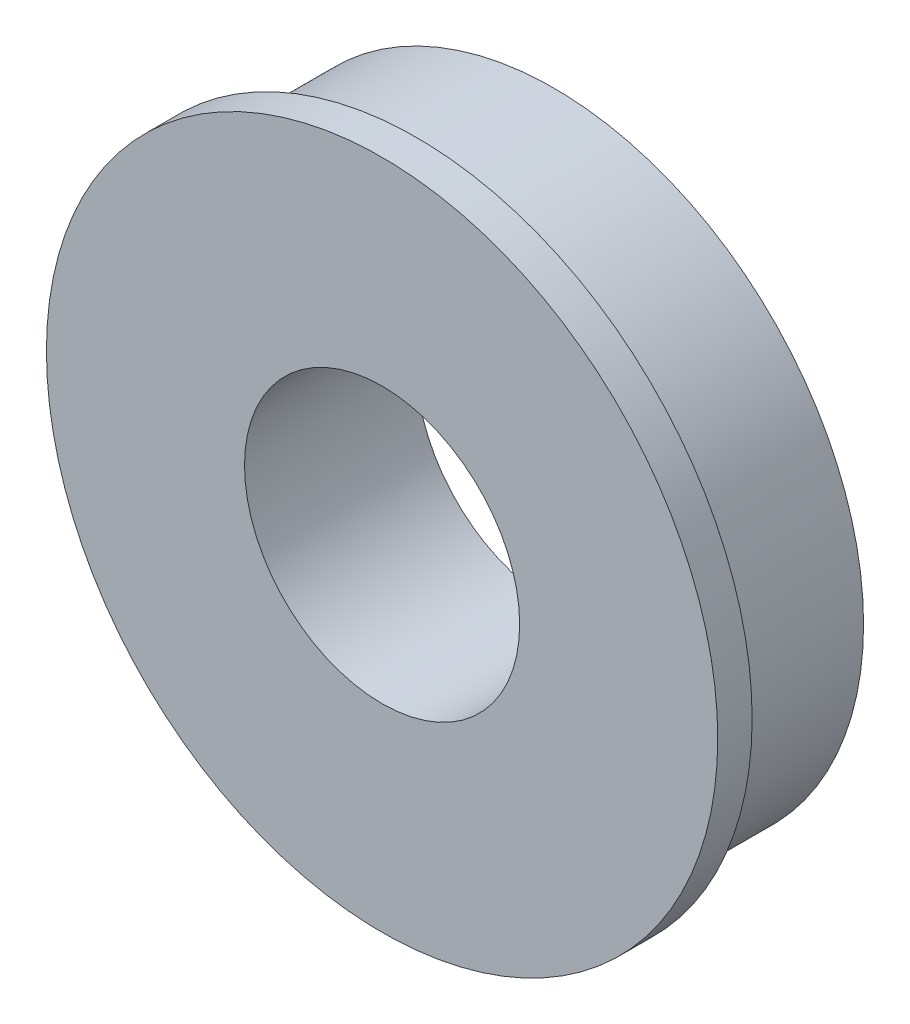
ISO-10303-21;
HEADER;
FILE_DESCRIPTION(('STEP AP214'),'2;1');
FILE_NAME('part.step','',(''),(''),'','','');
FILE_SCHEMA(('AUTOMOTIVE_DESIGN { 1 0 10303 214 1 1 1 1 }'));
ENDSEC;
DATA;
#1=APPLICATION_CONTEXT('core data for automotive mechanical design processes');
#2=APPLICATION_PROTOCOL_DEFINITION('international standard','automotive_design',2000,#1);
#3=PRODUCT_CONTEXT('',#1,'mechanical');
#4=PRODUCT('Part','Part','',(#3));
#5=PRODUCT_RELATED_PRODUCT_CATEGORY('part','',(#4));
#6=PRODUCT_DEFINITION_FORMATION('','',#4);
#7=PRODUCT_DEFINITION_CONTEXT('part definition',#1,'design');
#8=PRODUCT_DEFINITION('design','',#6,#7);
#9=PRODUCT_DEFINITION_SHAPE('','',#8);
#10=(LENGTH_UNIT() NAMED_UNIT(*) SI_UNIT(.MILLI.,.METRE.));
#11=(NAMED_UNIT(*) PLANE_ANGLE_UNIT() SI_UNIT($,.RADIAN.));
#12=(NAMED_UNIT(*) SI_UNIT($,.STERADIAN.) SOLID_ANGLE_UNIT());
#13=UNCERTAINTY_MEASURE_WITH_UNIT(LENGTH_MEASURE(1.E-05),#10,'distance_accuracy_value','');
#14=(GEOMETRIC_REPRESENTATION_CONTEXT(3) GLOBAL_UNCERTAINTY_ASSIGNED_CONTEXT((#13)) GLOBAL_UNIT_ASSIGNED_CONTEXT((#10,
#11,#12)) REPRESENTATION_CONTEXT('',''));
#15=CARTESIAN_POINT('',(0.,0.,0.));
#16=DIRECTION('',(0.,0.,1.));
#17=DIRECTION('',(1.,0.,0.));
#18=AXIS2_PLACEMENT_3D('',#15,#16,#17);
#19=CARTESIAN_POINT('',(0.,0.,0.));
#20=DIRECTION('',(0.,0.,1.));
#21=DIRECTION('',(1.,0.,0.));
#22=AXIS2_PLACEMENT_3D('',#19,#20,#21);
#23=PLANE('',#22);
#24=CARTESIAN_POINT('',(0.,0.,0.));
#25=DIRECTION('',(0.,0.,1.));
#26=DIRECTION('',(1.,0.,0.));
#27=AXIS2_PLACEMENT_3D('',#24,#25,#26);
#28=CIRCLE('',#27,6.35);
#29=CARTESIAN_POINT('',(-6.35,0.,0.));
#30=VERTEX_POINT('',#29);
#31=EDGE_CURVE('E133',#30,#30,#28,.T.);
#32=ORIENTED_EDGE('',*,*,#31,.T.);
#33=EDGE_LOOP('',(#32));
#34=FACE_BOUND('',#33,.T.);
#35=CARTESIAN_POINT('',(0.,0.,0.));
#36=DIRECTION('',(0.,0.,1.));
#37=DIRECTION('',(1.,0.,0.));
#38=AXIS2_PLACEMENT_3D('',#35,#36,#37);
#39=CIRCLE('',#38,14.2875);
#40=CARTESIAN_POINT('',(14.2875,0.,0.));
#41=VERTEX_POINT('',#40);
#42=CARTESIAN_POINT('',(-14.2875,0.,0.));
#43=VERTEX_POINT('',#42);
#44=EDGE_CURVE('E10',#41,#43,#39,.T.);
#45=ORIENTED_EDGE('',*,*,#44,.F.);
#46=CARTESIAN_POINT('',(0.,0.,0.));
#47=DIRECTION('',(0.,0.,1.));
#48=DIRECTION('',(1.,0.,0.));
#49=AXIS2_PLACEMENT_3D('',#46,#47,#48);
#50=CIRCLE('',#49,14.2875);
#51=EDGE_CURVE('E26',#43,#41,#50,.T.);
#52=ORIENTED_EDGE('',*,*,#51,.F.);
#53=EDGE_LOOP('',(#45,#52));
#54=FACE_BOUND('',#53,.T.);
#55=ADVANCED_FACE('F15',(#34,#54),#23,.F.);
#56=CARTESIAN_POINT('',(0.,0.,0.));
#57=DIRECTION('',(0.,0.,1.));
#58=DIRECTION('',(1.,0.,0.));
#59=AXIS2_PLACEMENT_3D('',#56,#57,#58);
#60=CYLINDRICAL_SURFACE('',#59,14.2875);
#61=CARTESIAN_POINT('',(0.,0.,6.35));
#62=DIRECTION('',(0.,0.,1.));
#63=DIRECTION('',(1.,0.,0.));
#64=AXIS2_PLACEMENT_3D('',#61,#62,#63);
#65=CIRCLE('',#64,14.2875);
#66=CARTESIAN_POINT('',(14.2875,0.,6.35));
#67=VERTEX_POINT('',#66);
#68=CARTESIAN_POINT('',(-14.2875,0.,6.35));
#69=VERTEX_POINT('',#68);
#70=EDGE_CURVE('E94',#67,#69,#65,.T.);
#71=ORIENTED_EDGE('',*,*,#70,.F.);
#72=CARTESIAN_POINT('',(0.,0.,6.35));
#73=DIRECTION('',(0.,0.,1.));
#74=DIRECTION('',(1.,0.,0.));
#75=AXIS2_PLACEMENT_3D('',#72,#73,#74);
#76=CIRCLE('',#75,14.2875);
#77=EDGE_CURVE('E144',#69,#67,#76,.T.);
#78=ORIENTED_EDGE('',*,*,#77,.F.);
#79=DIRECTION('',(0.,0.,-1.));
#80=VECTOR('',#79,1.);
#81=CARTESIAN_POINT('',(-14.2875,0.,0.));
#82=LINE('',#81,#80);
#83=EDGE_CURVE('E95',#69,#43,#82,.T.);
#84=ORIENTED_EDGE('',*,*,#83,.T.);
#85=ORIENTED_EDGE('',*,*,#51,.T.);
#86=ORIENTED_EDGE('',*,*,#44,.T.);
#87=ORIENTED_EDGE('',*,*,#83,.F.);
#88=EDGE_LOOP('',(#71,#78,#84,#85,#86,#87));
#89=FACE_BOUND('',#88,.T.);
#90=ADVANCED_FACE('F105',(#89),#60,.T.);
#91=CARTESIAN_POINT('',(0.,0.,7.9375));
#92=DIRECTION('',(0.,0.,1.));
#93=DIRECTION('',(1.,0.,0.));
#94=AXIS2_PLACEMENT_3D('',#91,#92,#93);
#95=PLANE('',#94);
#96=CARTESIAN_POINT('',(0.,0.,7.9375));
#97=DIRECTION('',(0.,0.,-1.));
#98=DIRECTION('',(1.,0.,0.));
#99=AXIS2_PLACEMENT_3D('',#96,#97,#98);
#100=CIRCLE('',#99,6.35);
#101=CARTESIAN_POINT('',(6.35,0.,7.9375));
#102=VERTEX_POINT('',#101);
#103=CARTESIAN_POINT('',(-6.35,0.,7.9375));
#104=VERTEX_POINT('',#103);
#105=EDGE_CURVE('E81',#102,#104,#100,.T.);
#106=ORIENTED_EDGE('',*,*,#105,.T.);
#107=CARTESIAN_POINT('',(0.,0.,7.9375));
#108=DIRECTION('',(0.,0.,-1.));
#109=DIRECTION('',(1.,0.,0.));
#110=AXIS2_PLACEMENT_3D('',#107,#108,#109);
#111=CIRCLE('',#110,6.35);
#112=EDGE_CURVE('E77',#104,#102,#111,.T.);
#113=ORIENTED_EDGE('',*,*,#112,.T.);
#114=EDGE_LOOP('',(#106,#113));
#115=FACE_BOUND('',#114,.T.);
#116=CARTESIAN_POINT('',(0.,0.,7.9375));
#117=DIRECTION('',(0.,0.,1.));
#118=DIRECTION('',(1.,0.,0.));
#119=AXIS2_PLACEMENT_3D('',#116,#117,#118);
#120=CIRCLE('',#119,15.494);
#121=CARTESIAN_POINT('',(15.494,0.,7.9375));
#122=VERTEX_POINT('',#121);
#123=CARTESIAN_POINT('',(-15.494,0.,7.9375));
#124=VERTEX_POINT('',#123);
#125=EDGE_CURVE('E147',#122,#124,#120,.T.);
#126=ORIENTED_EDGE('',*,*,#125,.T.);
#127=CARTESIAN_POINT('',(0.,0.,7.9375));
#128=DIRECTION('',(0.,0.,1.));
#129=DIRECTION('',(1.,0.,0.));
#130=AXIS2_PLACEMENT_3D('',#127,#128,#129);
#131=CIRCLE('',#130,15.494);
#132=EDGE_CURVE('E148',#124,#122,#131,.T.);
#133=ORIENTED_EDGE('',*,*,#132,.T.);
#134=EDGE_LOOP('',(#126,#133));
#135=FACE_BOUND('',#134,.T.);
#136=ADVANCED_FACE('F79',(#115,#135),#95,.T.);
#137=CARTESIAN_POINT('',(0.,0.,6.35));
#138=DIRECTION('',(0.,0.,1.));
#139=DIRECTION('',(1.,0.,0.));
#140=AXIS2_PLACEMENT_3D('',#137,#138,#139);
#141=CYLINDRICAL_SURFACE('',#140,15.494);
#142=ORIENTED_EDGE('',*,*,#125,.F.);
#143=ORIENTED_EDGE('',*,*,#132,.F.);
#144=DIRECTION('',(0.,0.,-1.));
#145=VECTOR('',#144,1.);
#146=CARTESIAN_POINT('',(-15.494,0.,6.35));
#147=LINE('',#146,#145);
#148=CARTESIAN_POINT('',(-15.494,0.,6.35));
#149=VERTEX_POINT('',#148);
#150=EDGE_CURVE('E99',#124,#149,#147,.T.);
#151=ORIENTED_EDGE('',*,*,#150,.T.);
#152=CARTESIAN_POINT('',(0.,0.,6.35));
#153=DIRECTION('',(0.,0.,1.));
#154=DIRECTION('',(1.,0.,0.));
#155=AXIS2_PLACEMENT_3D('',#152,#153,#154);
#156=CIRCLE('',#155,15.494);
#157=CARTESIAN_POINT('',(15.494,0.,6.35));
#158=VERTEX_POINT('',#157);
#159=EDGE_CURVE('E131',#149,#158,#156,.T.);
#160=ORIENTED_EDGE('',*,*,#159,.T.);
#161=CARTESIAN_POINT('',(0.,0.,6.35));
#162=DIRECTION('',(0.,0.,1.));
#163=DIRECTION('',(1.,0.,0.));
#164=AXIS2_PLACEMENT_3D('',#161,#162,#163);
#165=CIRCLE('',#164,15.494);
#166=EDGE_CURVE('E130',#158,#149,#165,.T.);
#167=ORIENTED_EDGE('',*,*,#166,.T.);
#168=ORIENTED_EDGE('',*,*,#150,.F.);
#169=EDGE_LOOP('',(#142,#143,#151,#160,#167,#168));
#170=FACE_BOUND('',#169,.T.);
#171=ADVANCED_FACE('F17',(#170),#141,.T.);
#172=CARTESIAN_POINT('',(0.,0.,6.35));
#173=DIRECTION('',(0.,0.,1.));
#174=DIRECTION('',(1.,0.,0.));
#175=AXIS2_PLACEMENT_3D('',#172,#173,#174);
#176=PLANE('',#175);
#177=ORIENTED_EDGE('',*,*,#70,.T.);
#178=ORIENTED_EDGE('',*,*,#77,.T.);
#179=EDGE_LOOP('',(#177,#178));
#180=FACE_BOUND('',#179,.T.);
#181=ORIENTED_EDGE('',*,*,#166,.F.);
#182=ORIENTED_EDGE('',*,*,#159,.F.);
#183=EDGE_LOOP('',(#181,#182));
#184=FACE_BOUND('',#183,.T.);
#185=ADVANCED_FACE('F118',(#180,#184),#176,.F.);
#186=CARTESIAN_POINT('',(0.,0.,7.9375));
#187=DIRECTION('',(0.,0.,-1.));
#188=DIRECTION('',(1.,0.,0.));
#189=AXIS2_PLACEMENT_3D('',#186,#187,#188);
#190=CYLINDRICAL_SURFACE('',#189,6.35);
#191=ORIENTED_EDGE('',*,*,#105,.F.);
#192=ORIENTED_EDGE('',*,*,#112,.F.);
#193=DIRECTION('',(0.,0.,-1.));
#194=VECTOR('',#193,1.);
#195=CARTESIAN_POINT('',(-6.35,0.,7.9375));
#196=LINE('',#195,#194);
#197=EDGE_CURVE('E19',#104,#30,#196,.T.);
#198=ORIENTED_EDGE('',*,*,#197,.T.);
#199=ORIENTED_EDGE('',*,*,#31,.F.);
#200=ORIENTED_EDGE('',*,*,#197,.F.);
#201=EDGE_LOOP('',(#191,#192,#198,#199,#200));
#202=FACE_BOUND('',#201,.T.);
#203=ADVANCED_FACE('F85',(#202),#190,.F.);
#204=CLOSED_SHELL('',(#55,#90,#136,#171,#185,#203));
#205=MANIFOLD_SOLID_BREP('B1',#204);
#206=ADVANCED_BREP_SHAPE_REPRESENTATION('',(#18,#205),#14);
#207=SHAPE_DEFINITION_REPRESENTATION(#9,#206);
ENDSEC;
END-ISO-10303-21;
